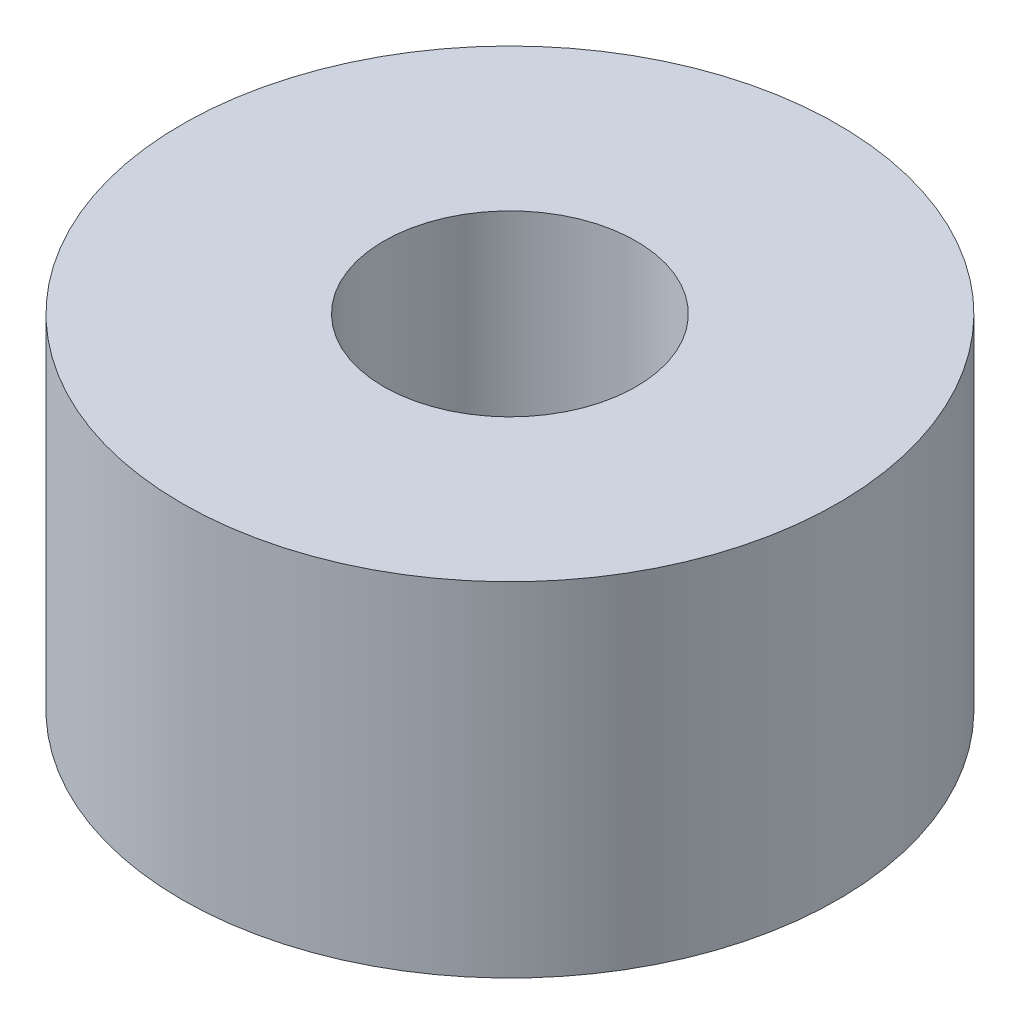
ISO-10303-21;
HEADER;
FILE_DESCRIPTION(('STEP AP214'),'2;1');
FILE_NAME('part.step','',(''),(''),'','','');
FILE_SCHEMA(('AUTOMOTIVE_DESIGN { 1 0 10303 214 1 1 1 1 }'));
ENDSEC;
DATA;
#1=APPLICATION_CONTEXT('core data for automotive mechanical design processes');
#2=APPLICATION_PROTOCOL_DEFINITION('international standard','automotive_design',2000,#1);
#3=PRODUCT_CONTEXT('',#1,'mechanical');
#4=PRODUCT('Part','Part','',(#3));
#5=PRODUCT_RELATED_PRODUCT_CATEGORY('part','',(#4));
#6=PRODUCT_DEFINITION_FORMATION('','',#4);
#7=PRODUCT_DEFINITION_CONTEXT('part definition',#1,'design');
#8=PRODUCT_DEFINITION('design','',#6,#7);
#9=PRODUCT_DEFINITION_SHAPE('','',#8);
#10=(LENGTH_UNIT() NAMED_UNIT(*) SI_UNIT(.MILLI.,.METRE.));
#11=(NAMED_UNIT(*) PLANE_ANGLE_UNIT() SI_UNIT($,.RADIAN.));
#12=(NAMED_UNIT(*) SI_UNIT($,.STERADIAN.) SOLID_ANGLE_UNIT());
#13=UNCERTAINTY_MEASURE_WITH_UNIT(LENGTH_MEASURE(1.E-05),#10,'distance_accuracy_value','');
#14=(GEOMETRIC_REPRESENTATION_CONTEXT(3) GLOBAL_UNCERTAINTY_ASSIGNED_CONTEXT((#13)) GLOBAL_UNIT_ASSIGNED_CONTEXT((#10,
#11,#12)) REPRESENTATION_CONTEXT('',''));
#15=CARTESIAN_POINT('',(0.,0.,0.));
#16=DIRECTION('',(0.,0.,1.));
#17=DIRECTION('',(1.,0.,0.));
#18=AXIS2_PLACEMENT_3D('',#15,#16,#17);
#19=CARTESIAN_POINT('',(0.,3.4,0.));
#20=DIRECTION('',(0.,1.,0.));
#21=DIRECTION('',(0.,0.,1.));
#22=AXIS2_PLACEMENT_3D('',#19,#20,#21);
#23=PLANE('',#22);
#24=CARTESIAN_POINT('',(0.,3.4,0.));
#25=DIRECTION('',(0.,1.,0.));
#26=DIRECTION('',(0.,0.,1.));
#27=AXIS2_PLACEMENT_3D('',#24,#25,#26);
#28=CIRCLE('',#27,3.25);
#29=CARTESIAN_POINT('',(0.,3.4,3.25));
#30=VERTEX_POINT('',#29);
#31=EDGE_CURVE('E10',#30,#30,#28,.T.);
#32=ORIENTED_EDGE('',*,*,#31,.T.);
#33=EDGE_LOOP('',(#32));
#34=FACE_BOUND('',#33,.T.);
#35=CARTESIAN_POINT('',(0.,3.4,0.));
#36=DIRECTION('',(0.,1.,0.));
#37=DIRECTION('',(0.,0.,1.));
#38=AXIS2_PLACEMENT_3D('',#35,#36,#37);
#39=CIRCLE('',#38,1.25);
#40=CARTESIAN_POINT('',(0.,3.4,1.25));
#41=VERTEX_POINT('',#40);
#42=EDGE_CURVE('E42',#41,#41,#39,.T.);
#43=ORIENTED_EDGE('',*,*,#42,.F.);
#44=EDGE_LOOP('',(#43));
#45=FACE_BOUND('',#44,.T.);
#46=ADVANCED_FACE('F31',(#34,#45),#23,.T.);
#47=CARTESIAN_POINT('',(0.,0.,0.));
#48=DIRECTION('',(0.,1.,0.));
#49=DIRECTION('',(0.,0.,1.));
#50=AXIS2_PLACEMENT_3D('',#47,#48,#49);
#51=PLANE('',#50);
#52=CARTESIAN_POINT('',(0.,0.,0.));
#53=DIRECTION('',(0.,1.,0.));
#54=DIRECTION('',(0.,0.,1.));
#55=AXIS2_PLACEMENT_3D('',#52,#53,#54);
#56=CIRCLE('',#55,3.25);
#57=CARTESIAN_POINT('',(0.,0.,3.25));
#58=VERTEX_POINT('',#57);
#59=EDGE_CURVE('E35',#58,#58,#56,.T.);
#60=ORIENTED_EDGE('',*,*,#59,.F.);
#61=EDGE_LOOP('',(#60));
#62=FACE_BOUND('',#61,.T.);
#63=CARTESIAN_POINT('',(0.,0.,0.));
#64=DIRECTION('',(0.,1.,0.));
#65=DIRECTION('',(0.,0.,1.));
#66=AXIS2_PLACEMENT_3D('',#63,#64,#65);
#67=CIRCLE('',#66,1.25);
#68=CARTESIAN_POINT('',(0.,0.,1.25));
#69=VERTEX_POINT('',#68);
#70=EDGE_CURVE('E44',#69,#69,#67,.T.);
#71=ORIENTED_EDGE('',*,*,#70,.T.);
#72=EDGE_LOOP('',(#71));
#73=FACE_BOUND('',#72,.T.);
#74=ADVANCED_FACE('F54',(#62,#73),#51,.F.);
#75=CARTESIAN_POINT('',(0.,3.4,0.));
#76=DIRECTION('',(0.,-1.,0.));
#77=DIRECTION('',(0.,0.,-1.));
#78=AXIS2_PLACEMENT_3D('',#75,#76,#77);
#79=CYLINDRICAL_SURFACE('',#78,3.25);
#80=ORIENTED_EDGE('',*,*,#31,.F.);
#81=EDGE_LOOP('',(#80));
#82=FACE_BOUND('',#81,.T.);
#83=ORIENTED_EDGE('',*,*,#59,.T.);
#84=EDGE_LOOP('',(#83));
#85=FACE_BOUND('',#84,.T.);
#86=ADVANCED_FACE('F33',(#82,#85),#79,.T.);
#87=CARTESIAN_POINT('',(0.,3.4,0.));
#88=DIRECTION('',(0.,-1.,0.));
#89=DIRECTION('',(0.,0.,-1.));
#90=AXIS2_PLACEMENT_3D('',#87,#88,#89);
#91=CYLINDRICAL_SURFACE('',#90,1.25);
#92=ORIENTED_EDGE('',*,*,#42,.T.);
#93=EDGE_LOOP('',(#92));
#94=FACE_BOUND('',#93,.T.);
#95=ORIENTED_EDGE('',*,*,#70,.F.);
#96=EDGE_LOOP('',(#95));
#97=FACE_BOUND('',#96,.T.);
#98=ADVANCED_FACE('F50',(#94,#97),#91,.F.);
#99=CLOSED_SHELL('',(#46,#74,#86,#98));
#100=MANIFOLD_SOLID_BREP('B2',#99);
#101=ADVANCED_BREP_SHAPE_REPRESENTATION('',(#18,#100),#14);
#102=SHAPE_DEFINITION_REPRESENTATION(#9,#101);
ENDSEC;
END-ISO-10303-21;
